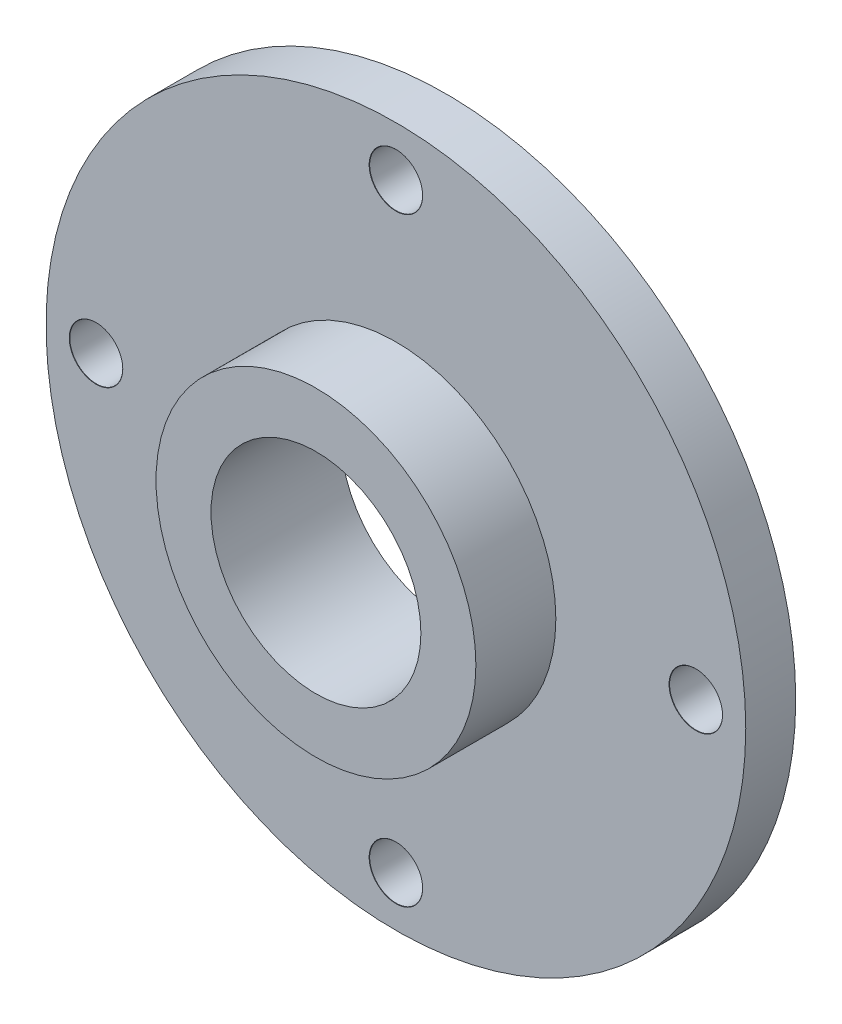
ISO-10303-21;
HEADER;
FILE_DESCRIPTION(('STEP AP214'),'2;1');
FILE_NAME('part.step','',(''),(''),'','','');
FILE_SCHEMA(('AUTOMOTIVE_DESIGN { 1 0 10303 214 1 1 1 1 }'));
ENDSEC;
DATA;
#1=APPLICATION_CONTEXT('core data for automotive mechanical design processes');
#2=APPLICATION_PROTOCOL_DEFINITION('international standard','automotive_design',2000,#1);
#3=PRODUCT_CONTEXT('',#1,'mechanical');
#4=PRODUCT('Part','Part','',(#3));
#5=PRODUCT_RELATED_PRODUCT_CATEGORY('part','',(#4));
#6=PRODUCT_DEFINITION_FORMATION('','',#4);
#7=PRODUCT_DEFINITION_CONTEXT('part definition',#1,'design');
#8=PRODUCT_DEFINITION('design','',#6,#7);
#9=PRODUCT_DEFINITION_SHAPE('','',#8);
#10=(LENGTH_UNIT() NAMED_UNIT(*) SI_UNIT(.MILLI.,.METRE.));
#11=(NAMED_UNIT(*) PLANE_ANGLE_UNIT() SI_UNIT($,.RADIAN.));
#12=(NAMED_UNIT(*) SI_UNIT($,.STERADIAN.) SOLID_ANGLE_UNIT());
#13=UNCERTAINTY_MEASURE_WITH_UNIT(LENGTH_MEASURE(1.E-05),#10,'distance_accuracy_value','');
#14=(GEOMETRIC_REPRESENTATION_CONTEXT(3) GLOBAL_UNCERTAINTY_ASSIGNED_CONTEXT((#13)) GLOBAL_UNIT_ASSIGNED_CONTEXT((#10,
#11,#12)) REPRESENTATION_CONTEXT('',''));
#15=CARTESIAN_POINT('',(0.,0.,0.));
#16=DIRECTION('',(0.,0.,1.));
#17=DIRECTION('',(1.,0.,0.));
#18=AXIS2_PLACEMENT_3D('',#15,#16,#17);
#19=CARTESIAN_POINT('',(0.,0.,5.));
#20=DIRECTION('',(0.,0.,1.));
#21=DIRECTION('',(1.,0.,0.));
#22=AXIS2_PLACEMENT_3D('',#19,#20,#21);
#23=PLANE('',#22);
#24=CARTESIAN_POINT('',(0.,0.,5.));
#25=DIRECTION('',(0.,0.,1.));
#26=DIRECTION('',(1.,0.,0.));
#27=AXIS2_PLACEMENT_3D('',#24,#25,#26);
#28=CIRCLE('',#27,16.);
#29=CARTESIAN_POINT('',(16.,0.,5.));
#30=VERTEX_POINT('',#29);
#31=EDGE_CURVE('E10',#30,#30,#28,.T.);
#32=ORIENTED_EDGE('',*,*,#31,.F.);
#33=EDGE_LOOP('',(#32));
#34=FACE_BOUND('',#33,.T.);
#35=CARTESIAN_POINT('',(30.,3.14233320495882E-13,5.));
#36=DIRECTION('',(0.,0.,1.));
#37=DIRECTION('',(1.,0.,0.));
#38=AXIS2_PLACEMENT_3D('',#35,#36,#37);
#39=CIRCLE('',#38,2.675);
#40=CARTESIAN_POINT('',(32.675,3.14233320495882E-13,5.));
#41=VERTEX_POINT('',#40);
#42=EDGE_CURVE('E60',#41,#41,#39,.T.);
#43=ORIENTED_EDGE('',*,*,#42,.F.);
#44=EDGE_LOOP('',(#43));
#45=FACE_BOUND('',#44,.T.);
#46=CARTESIAN_POINT('',(0.,-30.,5.));
#47=DIRECTION('',(0.,0.,1.));
#48=DIRECTION('',(1.,0.,0.));
#49=AXIS2_PLACEMENT_3D('',#46,#47,#48);
#50=CIRCLE('',#49,2.675);
#51=CARTESIAN_POINT('',(2.675,-30.,5.));
#52=VERTEX_POINT('',#51);
#53=EDGE_CURVE('E69',#52,#52,#50,.T.);
#54=ORIENTED_EDGE('',*,*,#53,.F.);
#55=EDGE_LOOP('',(#54));
#56=FACE_BOUND('',#55,.T.);
#57=CARTESIAN_POINT('',(-30.,-1.04744440165294E-13,5.));
#58=DIRECTION('',(0.,0.,1.));
#59=DIRECTION('',(1.,0.,0.));
#60=AXIS2_PLACEMENT_3D('',#57,#58,#59);
#61=CIRCLE('',#60,2.675);
#62=CARTESIAN_POINT('',(-27.325,-1.04744440165294E-13,5.));
#63=VERTEX_POINT('',#62);
#64=EDGE_CURVE('E78',#63,#63,#61,.T.);
#65=ORIENTED_EDGE('',*,*,#64,.F.);
#66=EDGE_LOOP('',(#65));
#67=FACE_BOUND('',#66,.T.);
#68=CARTESIAN_POINT('',(0.,30.,5.));
#69=DIRECTION('',(0.,0.,1.));
#70=DIRECTION('',(1.,0.,0.));
#71=AXIS2_PLACEMENT_3D('',#68,#69,#70);
#72=CIRCLE('',#71,2.675);
#73=CARTESIAN_POINT('',(2.675,30.,5.));
#74=VERTEX_POINT('',#73);
#75=EDGE_CURVE('E87',#74,#74,#72,.T.);
#76=ORIENTED_EDGE('',*,*,#75,.F.);
#77=EDGE_LOOP('',(#76));
#78=FACE_BOUND('',#77,.T.);
#79=CARTESIAN_POINT('',(0.,0.,5.));
#80=DIRECTION('',(0.,0.,1.));
#81=DIRECTION('',(1.,0.,0.));
#82=AXIS2_PLACEMENT_3D('',#79,#80,#81);
#83=CIRCLE('',#82,35.);
#84=CARTESIAN_POINT('',(35.,0.,5.));
#85=VERTEX_POINT('',#84);
#86=EDGE_CURVE('E51',#85,#85,#83,.T.);
#87=ORIENTED_EDGE('',*,*,#86,.T.);
#88=EDGE_LOOP('',(#87));
#89=FACE_BOUND('',#88,.T.);
#90=ADVANCED_FACE('F43',(#34,#45,#56,#67,#78,#89),#23,.T.);
#91=CARTESIAN_POINT('',(0.,0.,0.));
#92=DIRECTION('',(0.,0.,1.));
#93=DIRECTION('',(1.,0.,0.));
#94=AXIS2_PLACEMENT_3D('',#91,#92,#93);
#95=PLANE('',#94);
#96=CARTESIAN_POINT('',(30.,3.14233320495882E-13,0.));
#97=DIRECTION('',(0.,0.,1.));
#98=DIRECTION('',(1.,0.,0.));
#99=AXIS2_PLACEMENT_3D('',#96,#97,#98);
#100=CIRCLE('',#99,2.65);
#101=CARTESIAN_POINT('',(32.65,3.14233320495882E-13,0.));
#102=VERTEX_POINT('',#101);
#103=EDGE_CURVE('E66',#102,#102,#100,.T.);
#104=ORIENTED_EDGE('',*,*,#103,.T.);
#105=EDGE_LOOP('',(#104));
#106=FACE_BOUND('',#105,.T.);
#107=CARTESIAN_POINT('',(0.,-30.,0.));
#108=DIRECTION('',(0.,0.,1.));
#109=DIRECTION('',(1.,0.,0.));
#110=AXIS2_PLACEMENT_3D('',#107,#108,#109);
#111=CIRCLE('',#110,2.65);
#112=CARTESIAN_POINT('',(2.65,-30.,0.));
#113=VERTEX_POINT('',#112);
#114=EDGE_CURVE('E75',#113,#113,#111,.T.);
#115=ORIENTED_EDGE('',*,*,#114,.T.);
#116=EDGE_LOOP('',(#115));
#117=FACE_BOUND('',#116,.T.);
#118=CARTESIAN_POINT('',(-30.,-1.04744440165294E-13,0.));
#119=DIRECTION('',(0.,0.,1.));
#120=DIRECTION('',(1.,0.,0.));
#121=AXIS2_PLACEMENT_3D('',#118,#119,#120);
#122=CIRCLE('',#121,2.65);
#123=CARTESIAN_POINT('',(-27.35,-1.04744440165294E-13,0.));
#124=VERTEX_POINT('',#123);
#125=EDGE_CURVE('E84',#124,#124,#122,.T.);
#126=ORIENTED_EDGE('',*,*,#125,.T.);
#127=EDGE_LOOP('',(#126));
#128=FACE_BOUND('',#127,.T.);
#129=CARTESIAN_POINT('',(0.,30.,0.));
#130=DIRECTION('',(0.,0.,1.));
#131=DIRECTION('',(1.,0.,0.));
#132=AXIS2_PLACEMENT_3D('',#129,#130,#131);
#133=CIRCLE('',#132,2.65);
#134=CARTESIAN_POINT('',(2.65,30.,0.));
#135=VERTEX_POINT('',#134);
#136=EDGE_CURVE('E93',#135,#135,#133,.T.);
#137=ORIENTED_EDGE('',*,*,#136,.T.);
#138=EDGE_LOOP('',(#137));
#139=FACE_BOUND('',#138,.T.);
#140=CARTESIAN_POINT('',(0.,0.,0.));
#141=DIRECTION('',(0.,0.,1.));
#142=DIRECTION('',(1.,0.,0.));
#143=AXIS2_PLACEMENT_3D('',#140,#141,#142);
#144=CIRCLE('',#143,35.);
#145=CARTESIAN_POINT('',(35.,0.,0.));
#146=VERTEX_POINT('',#145);
#147=EDGE_CURVE('E47',#146,#146,#144,.T.);
#148=ORIENTED_EDGE('',*,*,#147,.F.);
#149=EDGE_LOOP('',(#148));
#150=FACE_BOUND('',#149,.T.);
#151=CARTESIAN_POINT('',(0.,0.,0.));
#152=DIRECTION('',(0.,0.,1.));
#153=DIRECTION('',(1.,0.,0.));
#154=AXIS2_PLACEMENT_3D('',#151,#152,#153);
#155=CIRCLE('',#154,10.5);
#156=CARTESIAN_POINT('',(10.5,0.,0.));
#157=VERTEX_POINT('',#156);
#158=EDGE_CURVE('E96',#157,#157,#155,.T.);
#159=ORIENTED_EDGE('',*,*,#158,.T.);
#160=EDGE_LOOP('',(#159));
#161=FACE_BOUND('',#160,.T.);
#162=ADVANCED_FACE('F104',(#106,#117,#128,#139,#150,#161),#95,.F.);
#163=CARTESIAN_POINT('',(0.,0.,5.));
#164=DIRECTION('',(0.,0.,-1.));
#165=DIRECTION('',(-1.,0.,0.));
#166=AXIS2_PLACEMENT_3D('',#163,#164,#165);
#167=CYLINDRICAL_SURFACE('',#166,35.);
#168=ORIENTED_EDGE('',*,*,#86,.F.);
#169=EDGE_LOOP('',(#168));
#170=FACE_BOUND('',#169,.T.);
#171=ORIENTED_EDGE('',*,*,#147,.T.);
#172=EDGE_LOOP('',(#171));
#173=FACE_BOUND('',#172,.T.);
#174=ADVANCED_FACE('F45',(#170,#173),#167,.T.);
#175=CARTESIAN_POINT('',(0.,0.,5.));
#176=DIRECTION('',(0.,0.,-1.));
#177=DIRECTION('',(-1.,0.,0.));
#178=AXIS2_PLACEMENT_3D('',#175,#176,#177);
#179=CYLINDRICAL_SURFACE('',#178,10.5);
#180=ORIENTED_EDGE('',*,*,#158,.F.);
#181=EDGE_LOOP('',(#180));
#182=FACE_BOUND('',#181,.T.);
#183=CARTESIAN_POINT('',(0.,0.,13.));
#184=DIRECTION('',(0.,0.,1.));
#185=DIRECTION('',(1.,0.,0.));
#186=AXIS2_PLACEMENT_3D('',#183,#184,#185);
#187=CIRCLE('',#186,10.5);
#188=CARTESIAN_POINT('',(10.5,0.,13.));
#189=VERTEX_POINT('',#188);
#190=EDGE_CURVE('E166',#189,#189,#187,.T.);
#191=ORIENTED_EDGE('',*,*,#190,.T.);
#192=EDGE_LOOP('',(#191));
#193=FACE_BOUND('',#192,.T.);
#194=ADVANCED_FACE('F112',(#182,#193),#179,.F.);
#195=CARTESIAN_POINT('',(0.,30.,5.));
#196=DIRECTION('',(0.,0.,1.));
#197=DIRECTION('',(1.,0.,0.));
#198=AXIS2_PLACEMENT_3D('',#195,#196,#197);
#199=CYLINDRICAL_SURFACE('',#198,2.65);
#200=ORIENTED_EDGE('',*,*,#136,.F.);
#201=EDGE_LOOP('',(#200));
#202=FACE_BOUND('',#201,.T.);
#203=CARTESIAN_POINT('',(0.,30.,4.975));
#204=DIRECTION('',(0.,0.,1.));
#205=DIRECTION('',(1.,0.,0.));
#206=AXIS2_PLACEMENT_3D('',#203,#204,#205);
#207=CIRCLE('',#206,2.65);
#208=CARTESIAN_POINT('',(2.65,30.,4.975));
#209=VERTEX_POINT('',#208);
#210=EDGE_CURVE('E90',#209,#209,#207,.T.);
#211=ORIENTED_EDGE('',*,*,#210,.T.);
#212=EDGE_LOOP('',(#211));
#213=FACE_BOUND('',#212,.T.);
#214=ADVANCED_FACE('F121',(#202,#213),#199,.F.);
#215=CARTESIAN_POINT('',(0.,30.,5.));
#216=DIRECTION('',(0.,0.,1.));
#217=DIRECTION('',(1.,0.,0.));
#218=AXIS2_PLACEMENT_3D('',#215,#216,#217);
#219=CONICAL_SURFACE('',#218,2.675,0.785398163397448);
#220=ORIENTED_EDGE('',*,*,#210,.F.);
#221=EDGE_LOOP('',(#220));
#222=FACE_BOUND('',#221,.T.);
#223=ORIENTED_EDGE('',*,*,#75,.T.);
#224=EDGE_LOOP('',(#223));
#225=FACE_BOUND('',#224,.T.);
#226=ADVANCED_FACE('F125',(#222,#225),#219,.F.);
#227=CARTESIAN_POINT('',(-30.,-1.04744440165294E-13,5.));
#228=DIRECTION('',(0.,0.,1.));
#229=DIRECTION('',(1.,0.,0.));
#230=AXIS2_PLACEMENT_3D('',#227,#228,#229);
#231=CYLINDRICAL_SURFACE('',#230,2.65);
#232=ORIENTED_EDGE('',*,*,#125,.F.);
#233=EDGE_LOOP('',(#232));
#234=FACE_BOUND('',#233,.T.);
#235=CARTESIAN_POINT('',(-30.,-1.04744440165294E-13,4.975));
#236=DIRECTION('',(0.,0.,1.));
#237=DIRECTION('',(1.,0.,0.));
#238=AXIS2_PLACEMENT_3D('',#235,#236,#237);
#239=CIRCLE('',#238,2.65);
#240=CARTESIAN_POINT('',(-27.35,-1.04744440165294E-13,4.975));
#241=VERTEX_POINT('',#240);
#242=EDGE_CURVE('E81',#241,#241,#239,.T.);
#243=ORIENTED_EDGE('',*,*,#242,.T.);
#244=EDGE_LOOP('',(#243));
#245=FACE_BOUND('',#244,.T.);
#246=ADVANCED_FACE('F128',(#234,#245),#231,.F.);
#247=CARTESIAN_POINT('',(-30.,-1.04744440165294E-13,5.));
#248=DIRECTION('',(0.,0.,1.));
#249=DIRECTION('',(1.,0.,0.));
#250=AXIS2_PLACEMENT_3D('',#247,#248,#249);
#251=CONICAL_SURFACE('',#250,2.675,0.785398163397448);
#252=ORIENTED_EDGE('',*,*,#242,.F.);
#253=EDGE_LOOP('',(#252));
#254=FACE_BOUND('',#253,.T.);
#255=ORIENTED_EDGE('',*,*,#64,.T.);
#256=EDGE_LOOP('',(#255));
#257=FACE_BOUND('',#256,.T.);
#258=ADVANCED_FACE('F131',(#254,#257),#251,.F.);
#259=CARTESIAN_POINT('',(0.,-30.,5.));
#260=DIRECTION('',(0.,0.,1.));
#261=DIRECTION('',(1.,0.,0.));
#262=AXIS2_PLACEMENT_3D('',#259,#260,#261);
#263=CYLINDRICAL_SURFACE('',#262,2.65);
#264=ORIENTED_EDGE('',*,*,#114,.F.);
#265=EDGE_LOOP('',(#264));
#266=FACE_BOUND('',#265,.T.);
#267=CARTESIAN_POINT('',(0.,-30.,4.975));
#268=DIRECTION('',(0.,0.,1.));
#269=DIRECTION('',(1.,0.,0.));
#270=AXIS2_PLACEMENT_3D('',#267,#268,#269);
#271=CIRCLE('',#270,2.65);
#272=CARTESIAN_POINT('',(2.65,-30.,4.975));
#273=VERTEX_POINT('',#272);
#274=EDGE_CURVE('E72',#273,#273,#271,.T.);
#275=ORIENTED_EDGE('',*,*,#274,.T.);
#276=EDGE_LOOP('',(#275));
#277=FACE_BOUND('',#276,.T.);
#278=ADVANCED_FACE('F135',(#266,#277),#263,.F.);
#279=CARTESIAN_POINT('',(0.,-30.,5.));
#280=DIRECTION('',(0.,0.,1.));
#281=DIRECTION('',(1.,0.,0.));
#282=AXIS2_PLACEMENT_3D('',#279,#280,#281);
#283=CONICAL_SURFACE('',#282,2.675,0.785398163397448);
#284=ORIENTED_EDGE('',*,*,#274,.F.);
#285=EDGE_LOOP('',(#284));
#286=FACE_BOUND('',#285,.T.);
#287=ORIENTED_EDGE('',*,*,#53,.T.);
#288=EDGE_LOOP('',(#287));
#289=FACE_BOUND('',#288,.T.);
#290=ADVANCED_FACE('F139',(#286,#289),#283,.F.);
#291=CARTESIAN_POINT('',(30.,3.14233320495882E-13,5.));
#292=DIRECTION('',(0.,0.,1.));
#293=DIRECTION('',(1.,0.,0.));
#294=AXIS2_PLACEMENT_3D('',#291,#292,#293);
#295=CYLINDRICAL_SURFACE('',#294,2.65);
#296=ORIENTED_EDGE('',*,*,#103,.F.);
#297=EDGE_LOOP('',(#296));
#298=FACE_BOUND('',#297,.T.);
#299=CARTESIAN_POINT('',(30.,3.14233320495882E-13,4.975));
#300=DIRECTION('',(0.,0.,1.));
#301=DIRECTION('',(1.,0.,0.));
#302=AXIS2_PLACEMENT_3D('',#299,#300,#301);
#303=CIRCLE('',#302,2.65);
#304=CARTESIAN_POINT('',(32.65,3.14233320495882E-13,4.975));
#305=VERTEX_POINT('',#304);
#306=EDGE_CURVE('E63',#305,#305,#303,.T.);
#307=ORIENTED_EDGE('',*,*,#306,.T.);
#308=EDGE_LOOP('',(#307));
#309=FACE_BOUND('',#308,.T.);
#310=ADVANCED_FACE('F143',(#298,#309),#295,.F.);
#311=CARTESIAN_POINT('',(30.,3.14233320495882E-13,5.));
#312=DIRECTION('',(0.,0.,1.));
#313=DIRECTION('',(1.,0.,0.));
#314=AXIS2_PLACEMENT_3D('',#311,#312,#313);
#315=CONICAL_SURFACE('',#314,2.675,0.785398163397379);
#316=ORIENTED_EDGE('',*,*,#306,.F.);
#317=EDGE_LOOP('',(#316));
#318=FACE_BOUND('',#317,.T.);
#319=ORIENTED_EDGE('',*,*,#42,.T.);
#320=EDGE_LOOP('',(#319));
#321=FACE_BOUND('',#320,.T.);
#322=ADVANCED_FACE('F147',(#318,#321),#315,.F.);
#323=CARTESIAN_POINT('',(0.,0.,13.));
#324=DIRECTION('',(0.,0.,1.));
#325=DIRECTION('',(1.,0.,0.));
#326=AXIS2_PLACEMENT_3D('',#323,#324,#325);
#327=PLANE('',#326);
#328=CARTESIAN_POINT('',(0.,0.,13.));
#329=DIRECTION('',(0.,0.,1.));
#330=DIRECTION('',(1.,0.,0.));
#331=AXIS2_PLACEMENT_3D('',#328,#329,#330);
#332=CIRCLE('',#331,16.);
#333=CARTESIAN_POINT('',(16.,0.,13.));
#334=VERTEX_POINT('',#333);
#335=EDGE_CURVE('E58',#334,#334,#332,.T.);
#336=ORIENTED_EDGE('',*,*,#335,.T.);
#337=EDGE_LOOP('',(#336));
#338=FACE_BOUND('',#337,.T.);
#339=ORIENTED_EDGE('',*,*,#190,.F.);
#340=EDGE_LOOP('',(#339));
#341=FACE_BOUND('',#340,.T.);
#342=ADVANCED_FACE('F151',(#338,#341),#327,.T.);
#343=CARTESIAN_POINT('',(0.,0.,13.));
#344=DIRECTION('',(0.,0.,-1.));
#345=DIRECTION('',(-1.,0.,0.));
#346=AXIS2_PLACEMENT_3D('',#343,#344,#345);
#347=CYLINDRICAL_SURFACE('',#346,16.);
#348=ORIENTED_EDGE('',*,*,#335,.F.);
#349=EDGE_LOOP('',(#348));
#350=FACE_BOUND('',#349,.T.);
#351=ORIENTED_EDGE('',*,*,#31,.T.);
#352=EDGE_LOOP('',(#351));
#353=FACE_BOUND('',#352,.T.);
#354=ADVANCED_FACE('F153',(#350,#353),#347,.T.);
#355=CLOSED_SHELL('',(#90,#162,#174,#194,#214,#226,#246,#258,#278,#290,#310,#322,#342,#354));
#356=MANIFOLD_SOLID_BREP('B2',#355);
#357=ADVANCED_BREP_SHAPE_REPRESENTATION('',(#18,#356),#14);
#358=SHAPE_DEFINITION_REPRESENTATION(#9,#357);
ENDSEC;
END-ISO-10303-21;
